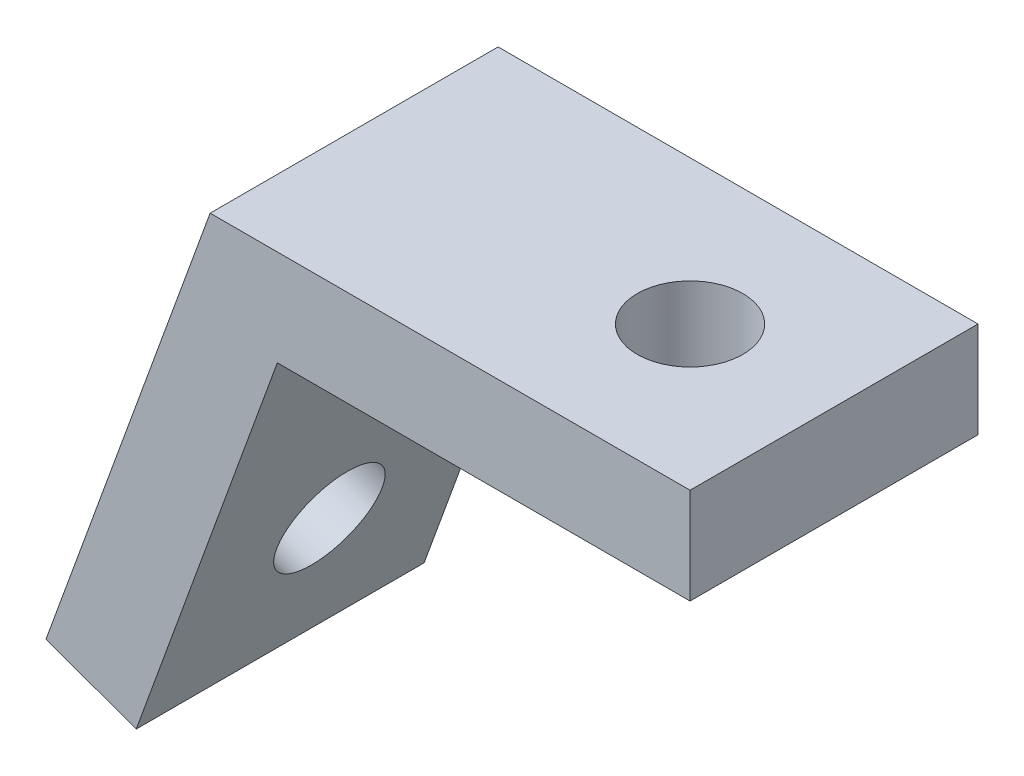
ISO-10303-21;
HEADER;
FILE_DESCRIPTION(('STEP AP214'),'2;1');
FILE_NAME('part.step','',(''),(''),'','','');
FILE_SCHEMA(('AUTOMOTIVE_DESIGN { 1 0 10303 214 1 1 1 1 }'));
ENDSEC;
DATA;
#1=APPLICATION_CONTEXT('core data for automotive mechanical design processes');
#2=APPLICATION_PROTOCOL_DEFINITION('international standard','automotive_design',2000,#1);
#3=PRODUCT_CONTEXT('',#1,'mechanical');
#4=PRODUCT('Part','Part','',(#3));
#5=PRODUCT_RELATED_PRODUCT_CATEGORY('part','',(#4));
#6=PRODUCT_DEFINITION_FORMATION('','',#4);
#7=PRODUCT_DEFINITION_CONTEXT('part definition',#1,'design');
#8=PRODUCT_DEFINITION('design','',#6,#7);
#9=PRODUCT_DEFINITION_SHAPE('','',#8);
#10=(LENGTH_UNIT() NAMED_UNIT(*) SI_UNIT(.MILLI.,.METRE.));
#11=(NAMED_UNIT(*) PLANE_ANGLE_UNIT() SI_UNIT($,.RADIAN.));
#12=(NAMED_UNIT(*) SI_UNIT($,.STERADIAN.) SOLID_ANGLE_UNIT());
#13=UNCERTAINTY_MEASURE_WITH_UNIT(LENGTH_MEASURE(1.E-05),#10,'distance_accuracy_value','');
#14=(GEOMETRIC_REPRESENTATION_CONTEXT(3) GLOBAL_UNCERTAINTY_ASSIGNED_CONTEXT((#13)) GLOBAL_UNIT_ASSIGNED_CONTEXT((#10,
#11,#12)) REPRESENTATION_CONTEXT('',''));
#15=CARTESIAN_POINT('',(0.,0.,0.));
#16=DIRECTION('',(0.,0.,1.));
#17=DIRECTION('',(1.,0.,0.));
#18=AXIS2_PLACEMENT_3D('',#15,#16,#17);
#19=CARTESIAN_POINT('',(7.0848047358059,-0.631082416895292,6.));
#20=DIRECTION('',(-1.,0.,0.));
#21=DIRECTION('',(0.,-1.,0.));
#22=AXIS2_PLACEMENT_3D('',#19,#20,#21);
#23=PLANE('',#22);
#24=DIRECTION('',(0.,1.,0.));
#25=VECTOR('',#24,1.);
#26=CARTESIAN_POINT('',(7.0848047358059,-0.631082416895292,0.));
#27=LINE('',#26,#25);
#28=CARTESIAN_POINT('',(7.0848047358059,-0.631082416895292,0.));
#29=VERTEX_POINT('',#28);
#30=CARTESIAN_POINT('',(7.0848047358059,1.36891758310471,0.));
#31=VERTEX_POINT('',#30);
#32=EDGE_CURVE('E130',#29,#31,#27,.T.);
#33=ORIENTED_EDGE('',*,*,#32,.T.);
#34=DIRECTION('',(0.,0.,-1.));
#35=VECTOR('',#34,1.);
#36=CARTESIAN_POINT('',(7.0848047358059,1.36891758310471,6.));
#37=LINE('',#36,#35);
#38=CARTESIAN_POINT('',(7.0848047358059,1.36891758310471,6.));
#39=VERTEX_POINT('',#38);
#40=EDGE_CURVE('E11',#39,#31,#37,.T.);
#41=ORIENTED_EDGE('',*,*,#40,.F.);
#42=DIRECTION('',(0.,1.,0.));
#43=VECTOR('',#42,1.);
#44=CARTESIAN_POINT('',(7.0848047358059,-0.631082416895292,6.));
#45=LINE('',#44,#43);
#46=CARTESIAN_POINT('',(7.0848047358059,-0.631082416895292,6.));
#47=VERTEX_POINT('',#46);
#48=EDGE_CURVE('E147',#47,#39,#45,.T.);
#49=ORIENTED_EDGE('',*,*,#48,.F.);
#50=DIRECTION('',(0.,0.,-1.));
#51=VECTOR('',#50,1.);
#52=CARTESIAN_POINT('',(7.0848047358059,-0.631082416895292,6.));
#53=LINE('',#52,#51);
#54=EDGE_CURVE('E126',#47,#29,#53,.T.);
#55=ORIENTED_EDGE('',*,*,#54,.T.);
#56=EDGE_LOOP('',(#33,#41,#49,#55));
#57=FACE_BOUND('',#56,.T.);
#58=ADVANCED_FACE('F39',(#57),#23,.F.);
#59=CARTESIAN_POINT('',(7.0848047358059,1.36891758310471,6.));
#60=DIRECTION('',(0.,-1.,0.));
#61=DIRECTION('',(1.,0.,0.));
#62=AXIS2_PLACEMENT_3D('',#59,#60,#61);
#63=PLANE('',#62);
#64=CARTESIAN_POINT('',(4.0848047358059,1.36891758310471,3.));
#65=DIRECTION('',(0.,1.,0.));
#66=DIRECTION('',(-1.,0.,0.));
#67=AXIS2_PLACEMENT_3D('',#64,#65,#66);
#68=CIRCLE('',#67,1.1);
#69=CARTESIAN_POINT('',(2.9848047358059,1.36891758310471,3.));
#70=VERTEX_POINT('',#69);
#71=EDGE_CURVE('E158',#70,#70,#68,.T.);
#72=ORIENTED_EDGE('',*,*,#71,.F.);
#73=EDGE_LOOP('',(#72));
#74=FACE_BOUND('',#73,.T.);
#75=DIRECTION('',(-1.,0.,0.));
#76=VECTOR('',#75,1.);
#77=CARTESIAN_POINT('',(7.0848047358059,1.36891758310471,0.));
#78=LINE('',#77,#76);
#79=CARTESIAN_POINT('',(-2.9151952641941,1.36891758310471,0.));
#80=VERTEX_POINT('',#79);
#81=EDGE_CURVE('E134',#31,#80,#78,.T.);
#82=ORIENTED_EDGE('',*,*,#81,.T.);
#83=DIRECTION('',(0.,0.,-1.));
#84=VECTOR('',#83,1.);
#85=CARTESIAN_POINT('',(-2.9151952641941,1.36891758310471,6.));
#86=LINE('',#85,#84);
#87=CARTESIAN_POINT('',(-2.9151952641941,1.36891758310471,6.));
#88=VERTEX_POINT('',#87);
#89=EDGE_CURVE('E49',#88,#80,#86,.T.);
#90=ORIENTED_EDGE('',*,*,#89,.F.);
#91=DIRECTION('',(-1.,0.,0.));
#92=VECTOR('',#91,1.);
#93=CARTESIAN_POINT('',(7.0848047358059,1.36891758310471,6.));
#94=LINE('',#93,#92);
#95=EDGE_CURVE('E95',#39,#88,#94,.T.);
#96=ORIENTED_EDGE('',*,*,#95,.F.);
#97=ORIENTED_EDGE('',*,*,#40,.T.);
#98=EDGE_LOOP('',(#82,#90,#96,#97));
#99=FACE_BOUND('',#98,.T.);
#100=ADVANCED_FACE('F177',(#74,#99),#63,.F.);
#101=CARTESIAN_POINT('',(-2.9151952641941,1.36891758310471,6.));
#102=DIRECTION('',(0.93969262078591,-0.342020143325665,0.));
#103=DIRECTION('',(0.342020143325665,0.93969262078591,0.));
#104=AXIS2_PLACEMENT_3D('',#101,#102,#103);
#105=PLANE('',#104);
#106=CARTESIAN_POINT('',(-5.30933626747376,-5.20893076239666,3.));
#107=DIRECTION('',(-0.93969262078591,0.342020143325665,0.));
#108=DIRECTION('',(-0.342020143325665,-0.93969262078591,0.));
#109=AXIS2_PLACEMENT_3D('',#106,#107,#108);
#110=CIRCLE('',#109,1.1);
#111=CARTESIAN_POINT('',(-5.68555842513199,-6.24259264526116,3.));
#112=VERTEX_POINT('',#111);
#113=EDGE_CURVE('E168',#112,#112,#110,.T.);
#114=ORIENTED_EDGE('',*,*,#113,.F.);
#115=EDGE_LOOP('',(#114));
#116=FACE_BOUND('',#115,.T.);
#117=DIRECTION('',(-0.342020143325665,-0.93969262078591,0.));
#118=VECTOR('',#117,1.);
#119=CARTESIAN_POINT('',(-2.9151952641941,1.36891758310471,0.));
#120=LINE('',#119,#118);
#121=CARTESIAN_POINT('',(-6.33539669745075,-8.02800862475439,0.));
#122=VERTEX_POINT('',#121);
#123=EDGE_CURVE('E138',#80,#122,#120,.T.);
#124=ORIENTED_EDGE('',*,*,#123,.T.);
#125=DIRECTION('',(0.,0.,-1.));
#126=VECTOR('',#125,1.);
#127=CARTESIAN_POINT('',(-6.33539669745075,-8.02800862475439,6.));
#128=LINE('',#127,#126);
#129=CARTESIAN_POINT('',(-6.33539669745075,-8.02800862475439,6.));
#130=VERTEX_POINT('',#129);
#131=EDGE_CURVE('E119',#130,#122,#128,.T.);
#132=ORIENTED_EDGE('',*,*,#131,.F.);
#133=DIRECTION('',(-0.342020143325665,-0.93969262078591,0.));
#134=VECTOR('',#133,1.);
#135=CARTESIAN_POINT('',(-2.9151952641941,1.36891758310471,6.));
#136=LINE('',#135,#134);
#137=EDGE_CURVE('E108',#88,#130,#136,.T.);
#138=ORIENTED_EDGE('',*,*,#137,.F.);
#139=ORIENTED_EDGE('',*,*,#89,.T.);
#140=EDGE_LOOP('',(#124,#132,#138,#139));
#141=FACE_BOUND('',#140,.T.);
#142=ADVANCED_FACE('F180',(#116,#141),#105,.F.);
#143=CARTESIAN_POINT('',(-6.33539669745075,-8.02800862475439,6.));
#144=DIRECTION('',(0.342020143325666,0.93969262078591,0.));
#145=DIRECTION('',(-0.93969262078591,0.342020143325666,0.));
#146=AXIS2_PLACEMENT_3D('',#143,#144,#145);
#147=PLANE('',#146);
#148=DIRECTION('',(0.939692620785909,-0.342020143325666,0.));
#149=VECTOR('',#148,1.);
#150=CARTESIAN_POINT('',(-6.33539669745075,-8.02800862475439,0.));
#151=LINE('',#150,#149);
#152=CARTESIAN_POINT('',(-4.45601145587893,-8.71204891140572,0.));
#153=VERTEX_POINT('',#152);
#154=EDGE_CURVE('E117',#122,#153,#151,.T.);
#155=ORIENTED_EDGE('',*,*,#154,.T.);
#156=DIRECTION('',(0.,0.,-1.));
#157=VECTOR('',#156,1.);
#158=CARTESIAN_POINT('',(-4.45601145587893,-8.71204891140572,6.));
#159=LINE('',#158,#157);
#160=CARTESIAN_POINT('',(-4.45601145587893,-8.71204891140572,6.));
#161=VERTEX_POINT('',#160);
#162=EDGE_CURVE('E114',#161,#153,#159,.T.);
#163=ORIENTED_EDGE('',*,*,#162,.F.);
#164=DIRECTION('',(0.939692620785909,-0.342020143325666,0.));
#165=VECTOR('',#164,1.);
#166=CARTESIAN_POINT('',(-6.33539669745075,-8.02800862475439,6.));
#167=LINE('',#166,#165);
#168=EDGE_CURVE('E102',#130,#161,#167,.T.);
#169=ORIENTED_EDGE('',*,*,#168,.F.);
#170=ORIENTED_EDGE('',*,*,#131,.T.);
#171=EDGE_LOOP('',(#155,#163,#169,#170));
#172=FACE_BOUND('',#171,.T.);
#173=ADVANCED_FACE('F115',(#172),#147,.F.);
#174=CARTESIAN_POINT('',(-4.45601145587893,-8.71204891140572,6.));
#175=DIRECTION('',(-0.93969262078591,0.342020143325665,0.));
#176=DIRECTION('',(-0.342020143325665,-0.93969262078591,0.));
#177=AXIS2_PLACEMENT_3D('',#174,#175,#176);
#178=PLANE('',#177);
#179=CARTESIAN_POINT('',(-3.42995102590194,-5.89297104904799,3.));
#180=DIRECTION('',(-0.93969262078591,0.342020143325665,0.));
#181=DIRECTION('',(-0.342020143325665,-0.93969262078591,0.));
#182=AXIS2_PLACEMENT_3D('',#179,#180,#181);
#183=CIRCLE('',#182,1.1);
#184=CARTESIAN_POINT('',(-3.80617318356017,-6.92663293191249,3.));
#185=VERTEX_POINT('',#184);
#186=EDGE_CURVE('E42',#185,#185,#183,.T.);
#187=ORIENTED_EDGE('',*,*,#186,.T.);
#188=EDGE_LOOP('',(#187));
#189=FACE_BOUND('',#188,.T.);
#190=DIRECTION('',(0.342020143325665,0.93969262078591,0.));
#191=VECTOR('',#190,1.);
#192=CARTESIAN_POINT('',(-4.45601145587893,-8.71204891140572,0.));
#193=LINE('',#192,#191);
#194=CARTESIAN_POINT('',(-1.51478018777468,-0.631082416895292,0.));
#195=VERTEX_POINT('',#194);
#196=EDGE_CURVE('E81',#153,#195,#193,.T.);
#197=ORIENTED_EDGE('',*,*,#196,.T.);
#198=DIRECTION('',(0.,0.,-1.));
#199=VECTOR('',#198,1.);
#200=CARTESIAN_POINT('',(-1.51478018777468,-0.631082416895292,6.));
#201=LINE('',#200,#199);
#202=CARTESIAN_POINT('',(-1.51478018777468,-0.631082416895292,6.));
#203=VERTEX_POINT('',#202);
#204=EDGE_CURVE('E120',#203,#195,#201,.T.);
#205=ORIENTED_EDGE('',*,*,#204,.F.);
#206=DIRECTION('',(0.342020143325665,0.93969262078591,0.));
#207=VECTOR('',#206,1.);
#208=CARTESIAN_POINT('',(-4.45601145587893,-8.71204891140572,6.));
#209=LINE('',#208,#207);
#210=EDGE_CURVE('E106',#161,#203,#209,.T.);
#211=ORIENTED_EDGE('',*,*,#210,.F.);
#212=ORIENTED_EDGE('',*,*,#162,.T.);
#213=EDGE_LOOP('',(#197,#205,#211,#212));
#214=FACE_BOUND('',#213,.T.);
#215=ADVANCED_FACE('F122',(#189,#214),#178,.F.);
#216=CARTESIAN_POINT('',(-1.51478018777468,-0.631082416895292,6.));
#217=DIRECTION('',(0.,1.,0.));
#218=DIRECTION('',(0.,0.,1.));
#219=AXIS2_PLACEMENT_3D('',#216,#217,#218);
#220=PLANE('',#219);
#221=CARTESIAN_POINT('',(4.0848047358059,-0.631082416895292,3.));
#222=DIRECTION('',(0.,1.,0.));
#223=DIRECTION('',(0.,0.,1.));
#224=AXIS2_PLACEMENT_3D('',#221,#222,#223);
#225=CIRCLE('',#224,1.1);
#226=CARTESIAN_POINT('',(4.0848047358059,-0.631082416895292,4.1));
#227=VERTEX_POINT('',#226);
#228=EDGE_CURVE('E135',#227,#227,#225,.T.);
#229=ORIENTED_EDGE('',*,*,#228,.T.);
#230=EDGE_LOOP('',(#229));
#231=FACE_BOUND('',#230,.T.);
#232=DIRECTION('',(1.,0.,0.));
#233=VECTOR('',#232,1.);
#234=CARTESIAN_POINT('',(-1.51478018777468,-0.631082416895292,0.));
#235=LINE('',#234,#233);
#236=EDGE_CURVE('E87',#195,#29,#235,.T.);
#237=ORIENTED_EDGE('',*,*,#236,.T.);
#238=ORIENTED_EDGE('',*,*,#54,.F.);
#239=DIRECTION('',(1.,0.,0.));
#240=VECTOR('',#239,1.);
#241=CARTESIAN_POINT('',(-1.51478018777468,-0.631082416895292,6.));
#242=LINE('',#241,#240);
#243=EDGE_CURVE('E58',#203,#47,#242,.T.);
#244=ORIENTED_EDGE('',*,*,#243,.F.);
#245=ORIENTED_EDGE('',*,*,#204,.T.);
#246=EDGE_LOOP('',(#237,#238,#244,#245));
#247=FACE_BOUND('',#246,.T.);
#248=ADVANCED_FACE('F185',(#231,#247),#220,.F.);
#249=CARTESIAN_POINT('',(0.,0.,6.));
#250=DIRECTION('',(0.,0.,1.));
#251=DIRECTION('',(1.,0.,0.));
#252=AXIS2_PLACEMENT_3D('',#249,#250,#251);
#253=PLANE('',#252);
#254=ORIENTED_EDGE('',*,*,#48,.T.);
#255=ORIENTED_EDGE('',*,*,#95,.T.);
#256=ORIENTED_EDGE('',*,*,#137,.T.);
#257=ORIENTED_EDGE('',*,*,#168,.T.);
#258=ORIENTED_EDGE('',*,*,#210,.T.);
#259=ORIENTED_EDGE('',*,*,#243,.T.);
#260=EDGE_LOOP('',(#254,#255,#256,#257,#258,#259));
#261=FACE_BOUND('',#260,.T.);
#262=ADVANCED_FACE('F104',(#261),#253,.T.);
#263=CARTESIAN_POINT('',(0.,0.,0.));
#264=DIRECTION('',(0.,0.,1.));
#265=DIRECTION('',(1.,0.,0.));
#266=AXIS2_PLACEMENT_3D('',#263,#264,#265);
#267=PLANE('',#266);
#268=ORIENTED_EDGE('',*,*,#32,.F.);
#269=ORIENTED_EDGE('',*,*,#236,.F.);
#270=ORIENTED_EDGE('',*,*,#196,.F.);
#271=ORIENTED_EDGE('',*,*,#154,.F.);
#272=ORIENTED_EDGE('',*,*,#123,.F.);
#273=ORIENTED_EDGE('',*,*,#81,.F.);
#274=EDGE_LOOP('',(#268,#269,#270,#271,#272,#273));
#275=FACE_BOUND('',#274,.T.);
#276=ADVANCED_FACE('F183',(#275),#267,.F.);
#277=CARTESIAN_POINT('',(4.0848047358059,-4.63108241689529,3.));
#278=DIRECTION('',(0.,1.,0.));
#279=DIRECTION('',(-1.,0.,0.));
#280=AXIS2_PLACEMENT_3D('',#277,#278,#279);
#281=CYLINDRICAL_SURFACE('',#280,1.1);
#282=ORIENTED_EDGE('',*,*,#71,.T.);
#283=EDGE_LOOP('',(#282));
#284=FACE_BOUND('',#283,.T.);
#285=ORIENTED_EDGE('',*,*,#228,.F.);
#286=EDGE_LOOP('',(#285));
#287=FACE_BOUND('',#286,.T.);
#288=ADVANCED_FACE('F230',(#284,#287),#281,.F.);
#289=CARTESIAN_POINT('',(0.3288194572417,-7.26105162235065,3.));
#290=DIRECTION('',(-0.93969262078591,0.342020143325665,0.));
#291=DIRECTION('',(-0.342020143325665,-0.93969262078591,0.));
#292=AXIS2_PLACEMENT_3D('',#289,#290,#291);
#293=CYLINDRICAL_SURFACE('',#292,1.1);
#294=CARTESIAN_POINT('',(-5.68555842513199,-6.24259264526116,3.));
#295=CARTESIAN_POINT('',(-5.66598149553228,-6.24971806491378,3.));
#296=CARTESIAN_POINT('',(-5.64640456593258,-6.25684348456639,3.));
#297=CARTESIAN_POINT('',(-5.60725070673316,-6.27109432387163,3.));
#298=CARTESIAN_POINT('',(-5.58767377713346,-6.27821974352425,3.));
#299=CARTESIAN_POINT('',(-5.54851991793404,-6.29247058282948,3.));
#300=CARTESIAN_POINT('',(-5.52894298833434,-6.2995960024821,3.));
#301=CARTESIAN_POINT('',(-5.48978912913493,-6.31384684178734,3.));
#302=CARTESIAN_POINT('',(-5.47021219953522,-6.32097226143996,3.));
#303=CARTESIAN_POINT('',(-5.43105834033581,-6.33522310074519,3.));
#304=CARTESIAN_POINT('',(-5.4114814107361,-6.34234852039781,3.));
#305=CARTESIAN_POINT('',(-5.37232755153669,-6.35659935970305,3.));
#306=CARTESIAN_POINT('',(-5.35275062193698,-6.36372477935567,3.));
#307=CARTESIAN_POINT('',(-5.31359676273757,-6.3779756186609,3.));
#308=CARTESIAN_POINT('',(-5.29401983313786,-6.38510103831352,3.));
#309=CARTESIAN_POINT('',(-5.25486597393845,-6.39935187761876,3.));
#310=CARTESIAN_POINT('',(-5.23528904433874,-6.40647729727137,3.));
#311=CARTESIAN_POINT('',(-5.19613518513933,-6.42072813657661,3.));
#312=CARTESIAN_POINT('',(-5.17655825553962,-6.42785355622923,3.));
#313=CARTESIAN_POINT('',(-5.13740439634021,-6.44210439553446,3.));
#314=CARTESIAN_POINT('',(-5.1178274667405,-6.44922981518708,3.));
#315=CARTESIAN_POINT('',(-5.07867360754109,-6.46348065449232,3.));
#316=CARTESIAN_POINT('',(-5.05909667794138,-6.47060607414494,3.));
#317=CARTESIAN_POINT('',(-5.01994281874197,-6.48485691345017,3.));
#318=CARTESIAN_POINT('',(-5.00036588914226,-6.49198233310279,3.));
#319=CARTESIAN_POINT('',(-4.96121202994285,-6.50623317240803,3.));
#320=CARTESIAN_POINT('',(-4.94163510034314,-6.51335859206065,3.));
#321=CARTESIAN_POINT('',(-4.90248124114373,-6.52760943136588,3.));
#322=CARTESIAN_POINT('',(-4.88290431154402,-6.5347348510185,3.));
#323=CARTESIAN_POINT('',(-4.84375045234461,-6.54898569032373,3.));
#324=CARTESIAN_POINT('',(-4.82417352274491,-6.55611110997635,3.));
#325=CARTESIAN_POINT('',(-4.78501966354549,-6.57036194928159,3.));
#326=CARTESIAN_POINT('',(-4.76544273394579,-6.57748736893421,3.));
#327=CARTESIAN_POINT('',(-4.72628887474637,-6.59173820823944,3.));
#328=CARTESIAN_POINT('',(-4.70671194514667,-6.59886362789206,3.));
#329=CARTESIAN_POINT('',(-4.66755808594725,-6.6131144671973,3.));
#330=CARTESIAN_POINT('',(-4.64798115634755,-6.62023988684992,3.));
#331=CARTESIAN_POINT('',(-4.60882729714813,-6.63449072615515,3.));
#332=CARTESIAN_POINT('',(-4.58925036754843,-6.64161614580777,3.));
#333=CARTESIAN_POINT('',(-4.55009650834901,-6.65586698511301,3.));
#334=CARTESIAN_POINT('',(-4.53051957874931,-6.66299240476562,3.));
#335=CARTESIAN_POINT('',(-4.4913657195499,-6.67724324407086,3.));
#336=CARTESIAN_POINT('',(-4.47178878995019,-6.68436866372348,3.));
#337=CARTESIAN_POINT('',(-4.43263493075078,-6.69861950302871,3.));
#338=CARTESIAN_POINT('',(-4.41305800115107,-6.70574492268133,3.));
#339=CARTESIAN_POINT('',(-4.37390414195166,-6.71999576198657,3.));
#340=CARTESIAN_POINT('',(-4.35432721235195,-6.72712118163918,3.));
#341=CARTESIAN_POINT('',(-4.31517335315254,-6.74137202094442,3.));
#342=CARTESIAN_POINT('',(-4.29559642355283,-6.74849744059704,3.));
#343=CARTESIAN_POINT('',(-4.25644256435342,-6.76274827990228,3.));
#344=CARTESIAN_POINT('',(-4.23686563475371,-6.76987369955489,3.));
#345=CARTESIAN_POINT('',(-4.1977117755543,-6.78412453886013,3.));
#346=CARTESIAN_POINT('',(-4.17813484595459,-6.79124995851275,3.));
#347=CARTESIAN_POINT('',(-4.13898098675518,-6.80550079781798,3.));
#348=CARTESIAN_POINT('',(-4.11940405715547,-6.8126262174706,3.));
#349=CARTESIAN_POINT('',(-4.08025019795606,-6.82687705677584,3.));
#350=CARTESIAN_POINT('',(-4.06067326835635,-6.83400247642846,3.));
#351=CARTESIAN_POINT('',(-4.02151940915694,-6.84825331573369,3.));
#352=CARTESIAN_POINT('',(-4.00194247955723,-6.85537873538631,3.));
#353=CARTESIAN_POINT('',(-3.96278862035782,-6.86962957469155,3.));
#354=CARTESIAN_POINT('',(-3.94321169075811,-6.87675499434416,3.));
#355=CARTESIAN_POINT('',(-3.9040578315587,-6.8910058336494,3.));
#356=CARTESIAN_POINT('',(-3.88448090195899,-6.89813125330202,3.));
#357=CARTESIAN_POINT('',(-3.84532704275958,-6.91238209260725,3.));
#358=CARTESIAN_POINT('',(-3.82575011315988,-6.91950751225987,3.));
#359=CARTESIAN_POINT('',(-3.80617318356017,-6.92663293191249,3.));
#360=B_SPLINE_CURVE_WITH_KNOTS('',3,(#294,#295,#296,#297,#298,#299,#300,#301,#302,#303,#304,
#305,#306,#307,#308,#309,#310,#311,#312,#313,#314,#315,#316,#317,#318,#319,#320,#321,#322,#323,
#324,#325,#326,#327,#328,#329,#330,#331,#332,#333,#334,#335,#336,#337,#338,#339,#340,#341,#342,
#343,#344,#345,#346,#347,#348,#349,#350,#351,#352,#353,#354,#355,#356,#357,#358,#359),
.UNSPECIFIED.,.F.,.F.,(4,2,2,2,2,2,2,2,2,2,2,2,2,2,2,2,2,2,2,2,2,2,2,2,2,2,2,2,2,2,2,2,4),(0.,
0.0625000000000004,0.125000000000001,0.1875,0.25,0.312500000000001,0.375,0.4375,
0.500000000000001,0.5625,0.625000000000001,0.687500000000001,0.75,0.812500000000001,
0.875000000000001,0.937500000000001,1.,1.0625,1.125,1.1875,1.25,1.3125,1.375,1.4375,1.5,1.5625,
1.625,1.6875,1.75,1.8125,1.875,1.9375,2.),.UNSPECIFIED.);
#361=EDGE_CURVE('BSEAM226',#112,#185,#360,.T.);
#362=ORIENTED_EDGE('',*,*,#113,.T.);
#363=ORIENTED_EDGE('',*,*,#186,.F.);
#364=ORIENTED_EDGE('',*,*,#361,.T.);
#365=ORIENTED_EDGE('',*,*,#361,.F.);
#366=EDGE_LOOP('',(#362,#364,#363,#365));
#367=FACE_BOUND('',#366,.T.);
#368=ADVANCED_FACE('F226',(#367),#293,.F.);
#369=CLOSED_SHELL('',(#58,#100,#142,#173,#215,#248,#262,#276,#288,#368));
#370=MANIFOLD_SOLID_BREP('B2',#369);
#371=ADVANCED_BREP_SHAPE_REPRESENTATION('',(#18,#370),#14);
#372=SHAPE_DEFINITION_REPRESENTATION(#9,#371);
ENDSEC;
END-ISO-10303-21;
